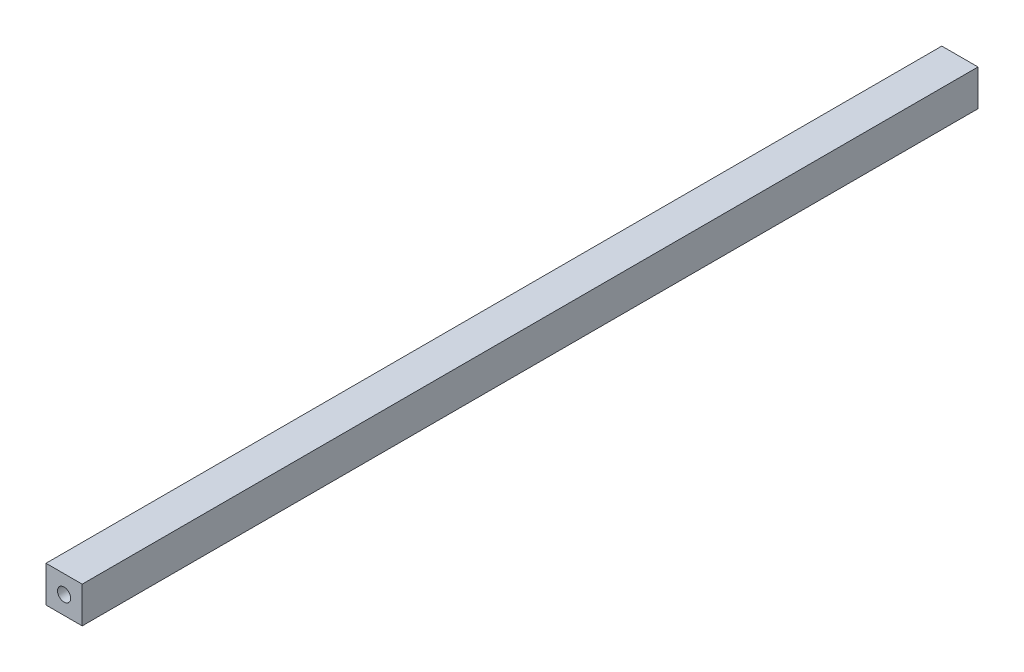
ISO-10303-21;
HEADER;
FILE_DESCRIPTION(('STEP AP214'),'2;1');
FILE_NAME('part.step','',(''),(''),'','','');
FILE_SCHEMA(('AUTOMOTIVE_DESIGN { 1 0 10303 214 1 1 1 1 }'));
ENDSEC;
DATA;
#1=APPLICATION_CONTEXT('core data for automotive mechanical design processes');
#2=APPLICATION_PROTOCOL_DEFINITION('international standard','automotive_design',2000,#1);
#3=PRODUCT_CONTEXT('',#1,'mechanical');
#4=PRODUCT('Part','Part','',(#3));
#5=PRODUCT_RELATED_PRODUCT_CATEGORY('part','',(#4));
#6=PRODUCT_DEFINITION_FORMATION('','',#4);
#7=PRODUCT_DEFINITION_CONTEXT('part definition',#1,'design');
#8=PRODUCT_DEFINITION('design','',#6,#7);
#9=PRODUCT_DEFINITION_SHAPE('','',#8);
#10=(LENGTH_UNIT() NAMED_UNIT(*) SI_UNIT(.MILLI.,.METRE.));
#11=(NAMED_UNIT(*) PLANE_ANGLE_UNIT() SI_UNIT($,.RADIAN.));
#12=(NAMED_UNIT(*) SI_UNIT($,.STERADIAN.) SOLID_ANGLE_UNIT());
#13=UNCERTAINTY_MEASURE_WITH_UNIT(LENGTH_MEASURE(1.E-05),#10,'distance_accuracy_value','');
#14=(GEOMETRIC_REPRESENTATION_CONTEXT(3) GLOBAL_UNCERTAINTY_ASSIGNED_CONTEXT((#13)) GLOBAL_UNIT_ASSIGNED_CONTEXT((#10,
#11,#12)) REPRESENTATION_CONTEXT('',''));
#15=CARTESIAN_POINT('',(0.,0.,0.));
#16=DIRECTION('',(0.,0.,1.));
#17=DIRECTION('',(1.,0.,0.));
#18=AXIS2_PLACEMENT_3D('',#15,#16,#17);
#19=CARTESIAN_POINT('',(4.,4.,99.));
#20=DIRECTION('',(-1.,0.,0.));
#21=DIRECTION('',(0.,-1.,0.));
#22=AXIS2_PLACEMENT_3D('',#19,#20,#21);
#23=PLANE('',#22);
#24=DIRECTION('',(0.,1.,0.));
#25=VECTOR('',#24,1.);
#26=CARTESIAN_POINT('',(4.,4.,-99.));
#27=LINE('',#26,#25);
#28=CARTESIAN_POINT('',(4.,-4.,-99.));
#29=VERTEX_POINT('',#28);
#30=CARTESIAN_POINT('',(4.,4.,-99.));
#31=VERTEX_POINT('',#30);
#32=EDGE_CURVE('E107',#29,#31,#27,.T.);
#33=ORIENTED_EDGE('',*,*,#32,.T.);
#34=DIRECTION('',(0.,0.,-1.));
#35=VECTOR('',#34,1.);
#36=CARTESIAN_POINT('',(4.,4.,99.));
#37=LINE('',#36,#35);
#38=CARTESIAN_POINT('',(4.,4.,99.));
#39=VERTEX_POINT('',#38);
#40=EDGE_CURVE('E11',#39,#31,#37,.T.);
#41=ORIENTED_EDGE('',*,*,#40,.F.);
#42=DIRECTION('',(0.,1.,0.));
#43=VECTOR('',#42,1.);
#44=CARTESIAN_POINT('',(4.,4.,99.));
#45=LINE('',#44,#43);
#46=CARTESIAN_POINT('',(4.,-4.,99.));
#47=VERTEX_POINT('',#46);
#48=EDGE_CURVE('E91',#47,#39,#45,.T.);
#49=ORIENTED_EDGE('',*,*,#48,.F.);
#50=DIRECTION('',(0.,0.,-1.));
#51=VECTOR('',#50,1.);
#52=CARTESIAN_POINT('',(4.,-4.,99.));
#53=LINE('',#52,#51);
#54=EDGE_CURVE('E103',#47,#29,#53,.T.);
#55=ORIENTED_EDGE('',*,*,#54,.T.);
#56=EDGE_LOOP('',(#33,#41,#49,#55));
#57=FACE_BOUND('',#56,.T.);
#58=ADVANCED_FACE('F39',(#57),#23,.F.);
#59=CARTESIAN_POINT('',(-4.,4.,99.));
#60=DIRECTION('',(0.,-1.,0.));
#61=DIRECTION('',(0.,0.,-1.));
#62=AXIS2_PLACEMENT_3D('',#59,#60,#61);
#63=PLANE('',#62);
#64=DIRECTION('',(-1.,0.,0.));
#65=VECTOR('',#64,1.);
#66=CARTESIAN_POINT('',(-4.,4.,-99.));
#67=LINE('',#66,#65);
#68=CARTESIAN_POINT('',(-4.,4.,-99.));
#69=VERTEX_POINT('',#68);
#70=EDGE_CURVE('E96',#31,#69,#67,.T.);
#71=ORIENTED_EDGE('',*,*,#70,.T.);
#72=DIRECTION('',(0.,0.,-1.));
#73=VECTOR('',#72,1.);
#74=CARTESIAN_POINT('',(-4.,4.,99.));
#75=LINE('',#74,#73);
#76=CARTESIAN_POINT('',(-4.,4.,99.));
#77=VERTEX_POINT('',#76);
#78=EDGE_CURVE('E48',#77,#69,#75,.T.);
#79=ORIENTED_EDGE('',*,*,#78,.F.);
#80=DIRECTION('',(-1.,0.,0.));
#81=VECTOR('',#80,1.);
#82=CARTESIAN_POINT('',(-4.,4.,99.));
#83=LINE('',#82,#81);
#84=EDGE_CURVE('E86',#39,#77,#83,.T.);
#85=ORIENTED_EDGE('',*,*,#84,.F.);
#86=ORIENTED_EDGE('',*,*,#40,.T.);
#87=EDGE_LOOP('',(#71,#79,#85,#86));
#88=FACE_BOUND('',#87,.T.);
#89=ADVANCED_FACE('F95',(#88),#63,.F.);
#90=CARTESIAN_POINT('',(-4.,4.,99.));
#91=DIRECTION('',(1.,0.,0.));
#92=DIRECTION('',(0.,1.,0.));
#93=AXIS2_PLACEMENT_3D('',#90,#91,#92);
#94=PLANE('',#93);
#95=DIRECTION('',(0.,-1.,0.));
#96=VECTOR('',#95,1.);
#97=CARTESIAN_POINT('',(-4.,4.,-99.));
#98=LINE('',#97,#96);
#99=CARTESIAN_POINT('',(-4.,-4.,-99.));
#100=VERTEX_POINT('',#99);
#101=EDGE_CURVE('E73',#69,#100,#98,.T.);
#102=ORIENTED_EDGE('',*,*,#101,.T.);
#103=DIRECTION('',(0.,0.,-1.));
#104=VECTOR('',#103,1.);
#105=CARTESIAN_POINT('',(-4.,-4.,99.));
#106=LINE('',#105,#104);
#107=CARTESIAN_POINT('',(-4.,-4.,99.));
#108=VERTEX_POINT('',#107);
#109=EDGE_CURVE('E98',#108,#100,#106,.T.);
#110=ORIENTED_EDGE('',*,*,#109,.F.);
#111=DIRECTION('',(0.,-1.,0.));
#112=VECTOR('',#111,1.);
#113=CARTESIAN_POINT('',(-4.,4.,99.));
#114=LINE('',#113,#112);
#115=EDGE_CURVE('E89',#77,#108,#114,.T.);
#116=ORIENTED_EDGE('',*,*,#115,.F.);
#117=ORIENTED_EDGE('',*,*,#78,.T.);
#118=EDGE_LOOP('',(#102,#110,#116,#117));
#119=FACE_BOUND('',#118,.T.);
#120=ADVANCED_FACE('F99',(#119),#94,.F.);
#121=CARTESIAN_POINT('',(-4.,-4.,99.));
#122=DIRECTION('',(0.,1.,0.));
#123=DIRECTION('',(0.,0.,1.));
#124=AXIS2_PLACEMENT_3D('',#121,#122,#123);
#125=PLANE('',#124);
#126=DIRECTION('',(1.,0.,0.));
#127=VECTOR('',#126,1.);
#128=CARTESIAN_POINT('',(-4.,-4.,-99.));
#129=LINE('',#128,#127);
#130=EDGE_CURVE('E79',#100,#29,#129,.T.);
#131=ORIENTED_EDGE('',*,*,#130,.T.);
#132=ORIENTED_EDGE('',*,*,#54,.F.);
#133=DIRECTION('',(1.,0.,0.));
#134=VECTOR('',#133,1.);
#135=CARTESIAN_POINT('',(-4.,-4.,99.));
#136=LINE('',#135,#134);
#137=EDGE_CURVE('E56',#108,#47,#136,.T.);
#138=ORIENTED_EDGE('',*,*,#137,.F.);
#139=ORIENTED_EDGE('',*,*,#109,.T.);
#140=EDGE_LOOP('',(#131,#132,#138,#139));
#141=FACE_BOUND('',#140,.T.);
#142=ADVANCED_FACE('F121',(#141),#125,.F.);
#143=CARTESIAN_POINT('',(0.,0.,99.));
#144=DIRECTION('',(0.,0.,1.));
#145=DIRECTION('',(1.,0.,0.));
#146=AXIS2_PLACEMENT_3D('',#143,#144,#145);
#147=PLANE('',#146);
#148=CARTESIAN_POINT('',(0.,0.,99.));
#149=DIRECTION('',(0.,0.,1.));
#150=DIRECTION('',(1.,0.,0.));
#151=AXIS2_PLACEMENT_3D('',#148,#149,#150);
#152=CIRCLE('',#151,1.45);
#153=CARTESIAN_POINT('',(1.45,0.,99.));
#154=VERTEX_POINT('',#153);
#155=EDGE_CURVE('E128',#154,#154,#152,.T.);
#156=ORIENTED_EDGE('',*,*,#155,.F.);
#157=EDGE_LOOP('',(#156));
#158=FACE_BOUND('',#157,.T.);
#159=ORIENTED_EDGE('',*,*,#48,.T.);
#160=ORIENTED_EDGE('',*,*,#84,.T.);
#161=ORIENTED_EDGE('',*,*,#115,.T.);
#162=ORIENTED_EDGE('',*,*,#137,.T.);
#163=EDGE_LOOP('',(#159,#160,#161,#162));
#164=FACE_BOUND('',#163,.T.);
#165=ADVANCED_FACE('F87',(#158,#164),#147,.T.);
#166=CARTESIAN_POINT('',(0.,0.,-99.));
#167=DIRECTION('',(0.,0.,1.));
#168=DIRECTION('',(1.,0.,0.));
#169=AXIS2_PLACEMENT_3D('',#166,#167,#168);
#170=PLANE('',#169);
#171=CARTESIAN_POINT('',(0.,0.,-99.));
#172=DIRECTION('',(0.,0.,1.));
#173=DIRECTION('',(1.,0.,0.));
#174=AXIS2_PLACEMENT_3D('',#171,#172,#173);
#175=CIRCLE('',#174,1.45);
#176=CARTESIAN_POINT('',(1.45,0.,-99.));
#177=VERTEX_POINT('',#176);
#178=EDGE_CURVE('E111',#177,#177,#175,.T.);
#179=ORIENTED_EDGE('',*,*,#178,.T.);
#180=EDGE_LOOP('',(#179));
#181=FACE_BOUND('',#180,.T.);
#182=ORIENTED_EDGE('',*,*,#32,.F.);
#183=ORIENTED_EDGE('',*,*,#130,.F.);
#184=ORIENTED_EDGE('',*,*,#101,.F.);
#185=ORIENTED_EDGE('',*,*,#70,.F.);
#186=EDGE_LOOP('',(#182,#183,#184,#185));
#187=FACE_BOUND('',#186,.T.);
#188=ADVANCED_FACE('F124',(#181,#187),#170,.F.);
#189=CARTESIAN_POINT('',(0.,0.,-99.));
#190=DIRECTION('',(0.,0.,1.));
#191=DIRECTION('',(1.,0.,0.));
#192=AXIS2_PLACEMENT_3D('',#189,#190,#191);
#193=CYLINDRICAL_SURFACE('',#192,1.45);
#194=ORIENTED_EDGE('',*,*,#178,.F.);
#195=EDGE_LOOP('',(#194));
#196=FACE_BOUND('',#195,.T.);
#197=ORIENTED_EDGE('',*,*,#155,.T.);
#198=EDGE_LOOP('',(#197));
#199=FACE_BOUND('',#198,.T.);
#200=ADVANCED_FACE('F137',(#196,#199),#193,.F.);
#201=CLOSED_SHELL('',(#58,#89,#120,#142,#165,#188,#200));
#202=MANIFOLD_SOLID_BREP('B2',#201);
#203=ADVANCED_BREP_SHAPE_REPRESENTATION('',(#18,#202),#14);
#204=SHAPE_DEFINITION_REPRESENTATION(#9,#203);
ENDSEC;
END-ISO-10303-21;
